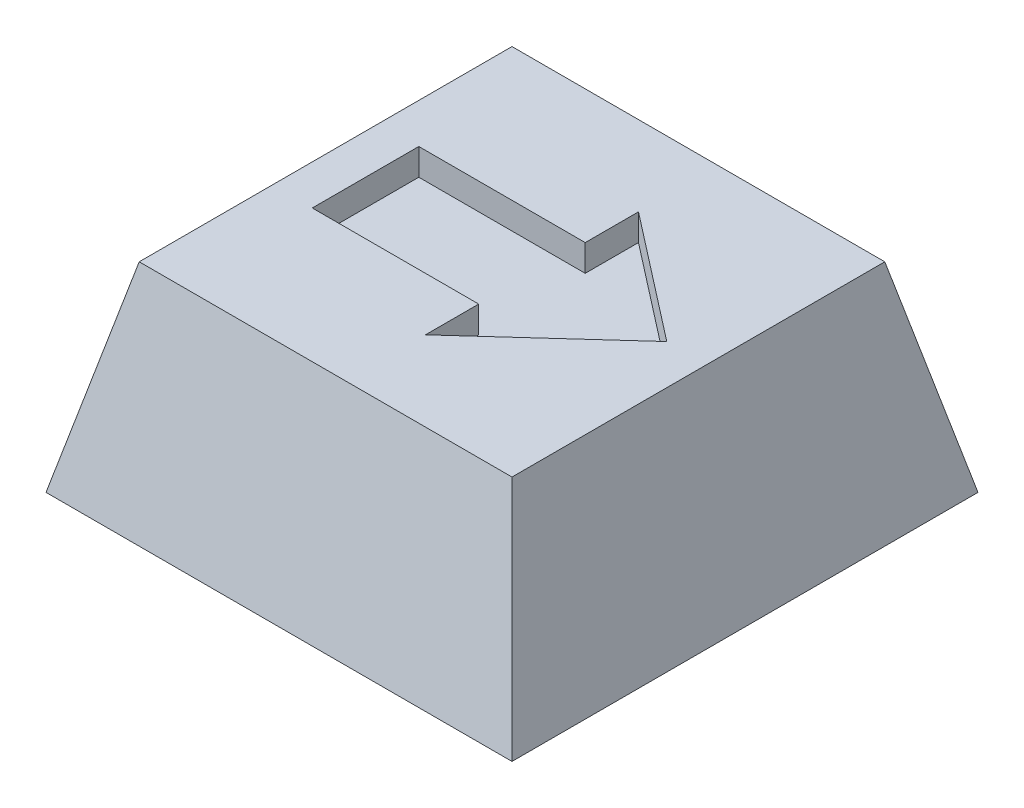
ISO-10303-21;
HEADER;
FILE_DESCRIPTION(('STEP AP214'),'2;1');
FILE_NAME('part.step','',(''),(''),'','','');
FILE_SCHEMA(('AUTOMOTIVE_DESIGN { 1 0 10303 214 1 1 1 1 }'));
ENDSEC;
DATA;
#1=APPLICATION_CONTEXT('core data for automotive mechanical design processes');
#2=APPLICATION_PROTOCOL_DEFINITION('international standard','automotive_design',2000,#1);
#3=PRODUCT_CONTEXT('',#1,'mechanical');
#4=PRODUCT('Part','Part','',(#3));
#5=PRODUCT_RELATED_PRODUCT_CATEGORY('part','',(#4));
#6=PRODUCT_DEFINITION_FORMATION('','',#4);
#7=PRODUCT_DEFINITION_CONTEXT('part definition',#1,'design');
#8=PRODUCT_DEFINITION('design','',#6,#7);
#9=PRODUCT_DEFINITION_SHAPE('','',#8);
#10=(LENGTH_UNIT() NAMED_UNIT(*) SI_UNIT(.MILLI.,.METRE.));
#11=(NAMED_UNIT(*) PLANE_ANGLE_UNIT() SI_UNIT($,.RADIAN.));
#12=(NAMED_UNIT(*) SI_UNIT($,.STERADIAN.) SOLID_ANGLE_UNIT());
#13=UNCERTAINTY_MEASURE_WITH_UNIT(LENGTH_MEASURE(1.E-05),#10,'distance_accuracy_value','');
#14=(GEOMETRIC_REPRESENTATION_CONTEXT(3) GLOBAL_UNCERTAINTY_ASSIGNED_CONTEXT((#13)) GLOBAL_UNIT_ASSIGNED_CONTEXT((#10,
#11,#12)) REPRESENTATION_CONTEXT('',''));
#15=CARTESIAN_POINT('',(0.,0.,0.));
#16=DIRECTION('',(0.,0.,1.));
#17=DIRECTION('',(1.,0.,0.));
#18=AXIS2_PLACEMENT_3D('',#15,#16,#17);
#19=CARTESIAN_POINT('',(0.,3.,0.));
#20=DIRECTION('',(0.,-1.,0.));
#21=DIRECTION('',(0.,0.,-1.));
#22=AXIS2_PLACEMENT_3D('',#19,#20,#21);
#23=PLANE('',#22);
#24=DIRECTION('',(0.,0.,-1.));
#25=VECTOR('',#24,1.);
#26=CARTESIAN_POINT('',(3.8,3.,0.));
#27=LINE('',#26,#25);
#28=CARTESIAN_POINT('',(3.8,3.,-1.9));
#29=VERTEX_POINT('',#28);
#30=CARTESIAN_POINT('',(3.8,3.,-2.7));
#31=VERTEX_POINT('',#30);
#32=EDGE_CURVE('E169',#29,#31,#27,.T.);
#33=ORIENTED_EDGE('',*,*,#32,.T.);
#34=DIRECTION('',(1.,0.,0.));
#35=VECTOR('',#34,1.);
#36=CARTESIAN_POINT('',(0.,3.,-2.7));
#37=LINE('',#36,#35);
#38=CARTESIAN_POINT('',(1.3,3.,-2.7));
#39=VERTEX_POINT('',#38);
#40=EDGE_CURVE('E58',#39,#31,#37,.T.);
#41=ORIENTED_EDGE('',*,*,#40,.F.);
#42=DIRECTION('',(0.,0.,1.));
#43=VECTOR('',#42,1.);
#44=CARTESIAN_POINT('',(1.3,3.,0.));
#45=LINE('',#44,#43);
#46=CARTESIAN_POINT('',(1.3,3.,-4.3));
#47=VERTEX_POINT('',#46);
#48=EDGE_CURVE('E150',#47,#39,#45,.T.);
#49=ORIENTED_EDGE('',*,*,#48,.F.);
#50=DIRECTION('',(1.,0.,0.));
#51=VECTOR('',#50,1.);
#52=CARTESIAN_POINT('',(0.,3.,-4.3));
#53=LINE('',#52,#51);
#54=CARTESIAN_POINT('',(3.8,3.,-4.3));
#55=VERTEX_POINT('',#54);
#56=EDGE_CURVE('E154',#47,#55,#53,.T.);
#57=ORIENTED_EDGE('',*,*,#56,.T.);
#58=CARTESIAN_POINT('',(3.8,3.,-5.1));
#59=VERTEX_POINT('',#58);
#60=EDGE_CURVE('E173',#55,#59,#27,.T.);
#61=ORIENTED_EDGE('',*,*,#60,.T.);
#62=DIRECTION('',(0.78987507361465,0.,0.61326777844776));
#63=VECTOR('',#62,1.);
#64=CARTESIAN_POINT('',(3.89963515011183,3.,-5.02264216303881));
#65=LINE('',#64,#63);
#66=CARTESIAN_POINT('',(5.7,3.,-3.6248189011479));
#67=VERTEX_POINT('',#66);
#68=EDGE_CURVE('E177',#59,#67,#65,.T.);
#69=ORIENTED_EDGE('',*,*,#68,.T.);
#70=DIRECTION('',(-0.740415843619596,0.,0.672149074623391));
#71=VECTOR('',#70,1.);
#72=CARTESIAN_POINT('',(0.77120797252663,3.,0.849535650859009));
#73=LINE('',#72,#71);
#74=EDGE_CURVE('E172',#67,#29,#73,.T.);
#75=ORIENTED_EDGE('',*,*,#74,.T.);
#76=EDGE_LOOP('',(#33,#41,#49,#57,#61,#69,#75));
#77=FACE_BOUND('',#76,.T.);
#78=DIRECTION('',(-1.,0.,0.));
#79=VECTOR('',#78,1.);
#80=CARTESIAN_POINT('',(11.,3.,-0.7));
#81=LINE('',#80,#79);
#82=CARTESIAN_POINT('',(6.3,3.,-0.7));
#83=VERTEX_POINT('',#82);
#84=CARTESIAN_POINT('',(0.7,3.,-0.7));
#85=VERTEX_POINT('',#84);
#86=EDGE_CURVE('E65',#83,#85,#81,.T.);
#87=ORIENTED_EDGE('',*,*,#86,.F.);
#88=DIRECTION('',(0.,0.,1.));
#89=VECTOR('',#88,1.);
#90=CARTESIAN_POINT('',(6.3,3.,-7.));
#91=LINE('',#90,#89);
#92=CARTESIAN_POINT('',(6.3,3.,-6.3));
#93=VERTEX_POINT('',#92);
#94=EDGE_CURVE('E221',#93,#83,#91,.T.);
#95=ORIENTED_EDGE('',*,*,#94,.F.);
#96=DIRECTION('',(-1.,0.,0.));
#97=VECTOR('',#96,1.);
#98=CARTESIAN_POINT('',(11.,3.,-6.3));
#99=LINE('',#98,#97);
#100=CARTESIAN_POINT('',(0.699999999999998,3.,-6.3));
#101=VERTEX_POINT('',#100);
#102=EDGE_CURVE('E206',#93,#101,#99,.T.);
#103=ORIENTED_EDGE('',*,*,#102,.T.);
#104=DIRECTION('',(0.,0.,1.));
#105=VECTOR('',#104,1.);
#106=CARTESIAN_POINT('',(0.7,3.,-7.));
#107=LINE('',#106,#105);
#108=EDGE_CURVE('E222',#101,#85,#107,.T.);
#109=ORIENTED_EDGE('',*,*,#108,.T.);
#110=EDGE_LOOP('',(#87,#95,#103,#109));
#111=FACE_BOUND('',#110,.T.);
#112=ADVANCED_FACE('F42',(#77,#111),#23,.F.);
#113=CARTESIAN_POINT('',(7.,0.,-7.));
#114=DIRECTION('',(-0.973841209741793,-0.227229615606418,0.));
#115=DIRECTION('',(0.227229615606418,-0.973841209741793,0.));
#116=AXIS2_PLACEMENT_3D('',#113,#114,#115);
#117=PLANE('',#116);
#118=DIRECTION('',(-0.221581128241521,0.949633406749377,-0.221581128241521));
#119=VECTOR('',#118,1.);
#120=CARTESIAN_POINT('',(6.6563126252505,1.47294589178357,-0.343687374749499));
#121=LINE('',#120,#119);
#122=CARTESIAN_POINT('',(7.,0.,0.));
#123=VERTEX_POINT('',#122);
#124=EDGE_CURVE('E218',#123,#83,#121,.T.);
#125=ORIENTED_EDGE('',*,*,#124,.F.);
#126=DIRECTION('',(0.,0.,-1.));
#127=VECTOR('',#126,1.);
#128=CARTESIAN_POINT('',(7.,0.,0.));
#129=LINE('',#128,#127);
#130=CARTESIAN_POINT('',(7.,0.,-7.));
#131=VERTEX_POINT('',#130);
#132=EDGE_CURVE('E236',#123,#131,#129,.T.);
#133=ORIENTED_EDGE('',*,*,#132,.T.);
#134=DIRECTION('',(0.221581128241521,-0.949633406749377,-0.221581128241521));
#135=VECTOR('',#134,1.);
#136=CARTESIAN_POINT('',(7.,0.,-7.));
#137=LINE('',#136,#135);
#138=EDGE_CURVE('E212',#93,#131,#137,.T.);
#139=ORIENTED_EDGE('',*,*,#138,.F.);
#140=ORIENTED_EDGE('',*,*,#94,.T.);
#141=EDGE_LOOP('',(#125,#133,#139,#140));
#142=FACE_BOUND('',#141,.T.);
#143=ADVANCED_FACE('F260',(#142),#117,.F.);
#144=CARTESIAN_POINT('',(0.,0.,-7.));
#145=DIRECTION('',(0.973841209741793,-0.227229615606418,0.));
#146=DIRECTION('',(0.227229615606418,0.973841209741793,0.));
#147=AXIS2_PLACEMENT_3D('',#144,#145,#146);
#148=PLANE('',#147);
#149=DIRECTION('',(-0.221581128241521,-0.949633406749378,0.221581128241521));
#150=VECTOR('',#149,1.);
#151=CARTESIAN_POINT('',(0.343687374749499,1.47294589178357,-0.3436873747495));
#152=LINE('',#151,#150);
#153=CARTESIAN_POINT('',(0.,0.,0.));
#154=VERTEX_POINT('',#153);
#155=EDGE_CURVE('E11',#85,#154,#152,.T.);
#156=ORIENTED_EDGE('',*,*,#155,.F.);
#157=ORIENTED_EDGE('',*,*,#108,.F.);
#158=DIRECTION('',(0.221581128241521,0.949633406749377,0.221581128241521));
#159=VECTOR('',#158,1.);
#160=CARTESIAN_POINT('',(0.,0.,-7.));
#161=LINE('',#160,#159);
#162=CARTESIAN_POINT('',(0.,0.,-7.));
#163=VERTEX_POINT('',#162);
#164=EDGE_CURVE('E51',#163,#101,#161,.T.);
#165=ORIENTED_EDGE('',*,*,#164,.F.);
#166=DIRECTION('',(0.,0.,1.));
#167=VECTOR('',#166,1.);
#168=CARTESIAN_POINT('',(0.,0.,0.));
#169=LINE('',#168,#167);
#170=EDGE_CURVE('E226',#163,#154,#169,.T.);
#171=ORIENTED_EDGE('',*,*,#170,.T.);
#172=EDGE_LOOP('',(#156,#157,#165,#171));
#173=FACE_BOUND('',#172,.T.);
#174=ADVANCED_FACE('F253',(#173),#148,.F.);
#175=CARTESIAN_POINT('',(0.,0.,0.));
#176=DIRECTION('',(0.,-1.,0.));
#177=DIRECTION('',(0.,0.,-1.));
#178=AXIS2_PLACEMENT_3D('',#175,#176,#177);
#179=PLANE('',#178);
#180=CARTESIAN_POINT('',(3.5,0.,-3.5));
#181=DIRECTION('',(0.,-1.,0.));
#182=DIRECTION('',(0.,0.,-1.));
#183=AXIS2_PLACEMENT_3D('',#180,#181,#182);
#184=CIRCLE('',#183,1.8);
#185=CARTESIAN_POINT('',(3.5,0.,-5.3));
#186=VERTEX_POINT('',#185);
#187=EDGE_CURVE('E187',#186,#186,#184,.T.);
#188=ORIENTED_EDGE('',*,*,#187,.F.);
#189=EDGE_LOOP('',(#188));
#190=FACE_BOUND('',#189,.T.);
#191=ORIENTED_EDGE('',*,*,#170,.F.);
#192=DIRECTION('',(-1.,0.,0.));
#193=VECTOR('',#192,1.);
#194=CARTESIAN_POINT('',(0.,0.,-7.));
#195=LINE('',#194,#193);
#196=EDGE_CURVE('E240',#131,#163,#195,.T.);
#197=ORIENTED_EDGE('',*,*,#196,.F.);
#198=ORIENTED_EDGE('',*,*,#132,.F.);
#199=DIRECTION('',(1.,0.,0.));
#200=VECTOR('',#199,1.);
#201=CARTESIAN_POINT('',(0.,0.,0.));
#202=LINE('',#201,#200);
#203=EDGE_CURVE('E233',#154,#123,#202,.T.);
#204=ORIENTED_EDGE('',*,*,#203,.F.);
#205=EDGE_LOOP('',(#191,#197,#198,#204));
#206=FACE_BOUND('',#205,.T.);
#207=ADVANCED_FACE('F44',(#190,#206),#179,.T.);
#208=CARTESIAN_POINT('',(11.,3.,-6.3));
#209=DIRECTION('',(0.,0.227229615606418,-0.973841209741793));
#210=DIRECTION('',(0.,0.973841209741793,0.227229615606418));
#211=AXIS2_PLACEMENT_3D('',#208,#209,#210);
#212=PLANE('',#211);
#213=ORIENTED_EDGE('',*,*,#138,.T.);
#214=ORIENTED_EDGE('',*,*,#196,.T.);
#215=ORIENTED_EDGE('',*,*,#164,.T.);
#216=ORIENTED_EDGE('',*,*,#102,.F.);
#217=EDGE_LOOP('',(#213,#214,#215,#216));
#218=FACE_BOUND('',#217,.T.);
#219=ADVANCED_FACE('F245',(#218),#212,.T.);
#220=CARTESIAN_POINT('',(11.,0.,0.));
#221=DIRECTION('',(0.,0.227229615606418,0.973841209741793));
#222=DIRECTION('',(0.,-0.973841209741793,0.227229615606418));
#223=AXIS2_PLACEMENT_3D('',#220,#221,#222);
#224=PLANE('',#223);
#225=ORIENTED_EDGE('',*,*,#124,.T.);
#226=ORIENTED_EDGE('',*,*,#86,.T.);
#227=ORIENTED_EDGE('',*,*,#155,.T.);
#228=ORIENTED_EDGE('',*,*,#203,.T.);
#229=EDGE_LOOP('',(#225,#226,#227,#228));
#230=FACE_BOUND('',#229,.T.);
#231=ADVANCED_FACE('F255',(#230),#224,.T.);
#232=CARTESIAN_POINT('',(3.5,0.8,-3.5));
#233=DIRECTION('',(0.,-1.,0.));
#234=DIRECTION('',(0.,0.,-1.));
#235=AXIS2_PLACEMENT_3D('',#232,#233,#234);
#236=CYLINDRICAL_SURFACE('',#235,1.8);
#237=CARTESIAN_POINT('',(3.5,0.8,-3.5));
#238=DIRECTION('',(0.,-1.,0.));
#239=DIRECTION('',(0.,0.,-1.));
#240=AXIS2_PLACEMENT_3D('',#237,#238,#239);
#241=CIRCLE('',#240,1.8);
#242=CARTESIAN_POINT('',(3.5,0.8,-5.3));
#243=VERTEX_POINT('',#242);
#244=EDGE_CURVE('E202',#243,#243,#241,.T.);
#245=ORIENTED_EDGE('',*,*,#244,.F.);
#246=EDGE_LOOP('',(#245));
#247=FACE_BOUND('',#246,.T.);
#248=ORIENTED_EDGE('',*,*,#187,.T.);
#249=EDGE_LOOP('',(#248));
#250=FACE_BOUND('',#249,.T.);
#251=ADVANCED_FACE('F281',(#247,#250),#236,.F.);
#252=CARTESIAN_POINT('',(3.5,0.8,-3.5));
#253=DIRECTION('',(0.,-1.,0.));
#254=DIRECTION('',(0.,0.,-1.));
#255=AXIS2_PLACEMENT_3D('',#252,#253,#254);
#256=PLANE('',#255);
#257=ORIENTED_EDGE('',*,*,#244,.T.);
#258=EDGE_LOOP('',(#257));
#259=FACE_BOUND('',#258,.T.);
#260=ADVANCED_FACE('F284',(#259),#256,.T.);
#261=CARTESIAN_POINT('',(0.,2.6,-2.7));
#262=DIRECTION('',(0.,0.,1.));
#263=DIRECTION('',(1.,0.,0.));
#264=AXIS2_PLACEMENT_3D('',#261,#262,#263);
#265=PLANE('',#264);
#266=ORIENTED_EDGE('',*,*,#40,.T.);
#267=DIRECTION('',(0.,1.,0.));
#268=VECTOR('',#267,1.);
#269=CARTESIAN_POINT('',(3.8,2.6,-2.7));
#270=LINE('',#269,#268);
#271=CARTESIAN_POINT('',(3.8,2.6,-2.7));
#272=VERTEX_POINT('',#271);
#273=EDGE_CURVE('E129',#272,#31,#270,.T.);
#274=ORIENTED_EDGE('',*,*,#273,.F.);
#275=DIRECTION('',(1.,0.,0.));
#276=VECTOR('',#275,1.);
#277=CARTESIAN_POINT('',(0.,2.6,-2.7));
#278=LINE('',#277,#276);
#279=CARTESIAN_POINT('',(1.3,2.6,-2.7));
#280=VERTEX_POINT('',#279);
#281=EDGE_CURVE('E137',#280,#272,#278,.T.);
#282=ORIENTED_EDGE('',*,*,#281,.F.);
#283=DIRECTION('',(0.,1.,0.));
#284=VECTOR('',#283,1.);
#285=CARTESIAN_POINT('',(1.3,2.6,-2.7));
#286=LINE('',#285,#284);
#287=EDGE_CURVE('E184',#280,#39,#286,.T.);
#288=ORIENTED_EDGE('',*,*,#287,.T.);
#289=EDGE_LOOP('',(#266,#274,#282,#288));
#290=FACE_BOUND('',#289,.T.);
#291=ADVANCED_FACE('F141',(#290),#265,.F.);
#292=CARTESIAN_POINT('',(1.3,2.6,0.));
#293=DIRECTION('',(-1.,0.,0.));
#294=DIRECTION('',(0.,0.,1.));
#295=AXIS2_PLACEMENT_3D('',#292,#293,#294);
#296=PLANE('',#295);
#297=ORIENTED_EDGE('',*,*,#48,.T.);
#298=ORIENTED_EDGE('',*,*,#287,.F.);
#299=DIRECTION('',(0.,0.,1.));
#300=VECTOR('',#299,1.);
#301=CARTESIAN_POINT('',(1.3,2.6,0.));
#302=LINE('',#301,#300);
#303=CARTESIAN_POINT('',(1.3,2.6,-4.3));
#304=VERTEX_POINT('',#303);
#305=EDGE_CURVE('E144',#304,#280,#302,.T.);
#306=ORIENTED_EDGE('',*,*,#305,.F.);
#307=DIRECTION('',(0.,1.,0.));
#308=VECTOR('',#307,1.);
#309=CARTESIAN_POINT('',(1.3,2.6,-4.3));
#310=LINE('',#309,#308);
#311=EDGE_CURVE('E188',#304,#47,#310,.T.);
#312=ORIENTED_EDGE('',*,*,#311,.T.);
#313=EDGE_LOOP('',(#297,#298,#306,#312));
#314=FACE_BOUND('',#313,.T.);
#315=ADVANCED_FACE('F291',(#314),#296,.F.);
#316=CARTESIAN_POINT('',(0.,2.6,-4.3));
#317=DIRECTION('',(0.,0.,1.));
#318=DIRECTION('',(1.,0.,0.));
#319=AXIS2_PLACEMENT_3D('',#316,#317,#318);
#320=PLANE('',#319);
#321=ORIENTED_EDGE('',*,*,#56,.F.);
#322=ORIENTED_EDGE('',*,*,#311,.F.);
#323=DIRECTION('',(1.,0.,0.));
#324=VECTOR('',#323,1.);
#325=CARTESIAN_POINT('',(0.,2.6,-4.3));
#326=LINE('',#325,#324);
#327=CARTESIAN_POINT('',(3.8,2.6,-4.3));
#328=VERTEX_POINT('',#327);
#329=EDGE_CURVE('E162',#304,#328,#326,.T.);
#330=ORIENTED_EDGE('',*,*,#329,.T.);
#331=DIRECTION('',(0.,1.,0.));
#332=VECTOR('',#331,1.);
#333=CARTESIAN_POINT('',(3.8,2.6,-4.3));
#334=LINE('',#333,#332);
#335=EDGE_CURVE('E191',#328,#55,#334,.T.);
#336=ORIENTED_EDGE('',*,*,#335,.T.);
#337=EDGE_LOOP('',(#321,#322,#330,#336));
#338=FACE_BOUND('',#337,.T.);
#339=ADVANCED_FACE('F303',(#338),#320,.T.);
#340=CARTESIAN_POINT('',(3.8,2.6,0.));
#341=DIRECTION('',(1.,0.,0.));
#342=DIRECTION('',(0.,0.,-1.));
#343=AXIS2_PLACEMENT_3D('',#340,#341,#342);
#344=PLANE('',#343);
#345=ORIENTED_EDGE('',*,*,#60,.F.);
#346=ORIENTED_EDGE('',*,*,#335,.F.);
#347=DIRECTION('',(0.,0.,-1.));
#348=VECTOR('',#347,1.);
#349=CARTESIAN_POINT('',(3.8,2.6,0.));
#350=LINE('',#349,#348);
#351=CARTESIAN_POINT('',(3.8,2.6,-5.1));
#352=VERTEX_POINT('',#351);
#353=EDGE_CURVE('E139',#328,#352,#350,.T.);
#354=ORIENTED_EDGE('',*,*,#353,.T.);
#355=DIRECTION('',(0.,1.,0.));
#356=VECTOR('',#355,1.);
#357=CARTESIAN_POINT('',(3.8,2.6,-5.1));
#358=LINE('',#357,#356);
#359=EDGE_CURVE('E194',#352,#59,#358,.T.);
#360=ORIENTED_EDGE('',*,*,#359,.T.);
#361=EDGE_LOOP('',(#345,#346,#354,#360));
#362=FACE_BOUND('',#361,.T.);
#363=ADVANCED_FACE('F299',(#362),#344,.T.);
#364=CARTESIAN_POINT('',(3.89963515011183,2.6,-5.02264216303881));
#365=DIRECTION('',(-0.61326777844776,0.,0.78987507361465));
#366=DIRECTION('',(0.78987507361465,0.,0.61326777844776));
#367=AXIS2_PLACEMENT_3D('',#364,#365,#366);
#368=PLANE('',#367);
#369=ORIENTED_EDGE('',*,*,#68,.F.);
#370=ORIENTED_EDGE('',*,*,#359,.F.);
#371=DIRECTION('',(0.78987507361465,0.,0.61326777844776));
#372=VECTOR('',#371,1.);
#373=CARTESIAN_POINT('',(3.89963515011183,2.6,-5.02264216303881));
#374=LINE('',#373,#372);
#375=CARTESIAN_POINT('',(5.7,2.6,-3.6248189011479));
#376=VERTEX_POINT('',#375);
#377=EDGE_CURVE('E159',#352,#376,#374,.T.);
#378=ORIENTED_EDGE('',*,*,#377,.T.);
#379=DIRECTION('',(0.,1.,0.));
#380=VECTOR('',#379,1.);
#381=CARTESIAN_POINT('',(5.7,2.6,-3.6248189011479));
#382=LINE('',#381,#380);
#383=EDGE_CURVE('E197',#376,#67,#382,.T.);
#384=ORIENTED_EDGE('',*,*,#383,.T.);
#385=EDGE_LOOP('',(#369,#370,#378,#384));
#386=FACE_BOUND('',#385,.T.);
#387=ADVANCED_FACE('F295',(#386),#368,.T.);
#388=CARTESIAN_POINT('',(0.77120797252663,2.6,0.849535650859009));
#389=DIRECTION('',(-0.672149074623391,0.,-0.740415843619596));
#390=DIRECTION('',(-0.740415843619596,0.,0.672149074623391));
#391=AXIS2_PLACEMENT_3D('',#388,#389,#390);
#392=PLANE('',#391);
#393=ORIENTED_EDGE('',*,*,#74,.F.);
#394=ORIENTED_EDGE('',*,*,#383,.F.);
#395=DIRECTION('',(-0.740415843619596,0.,0.672149074623391));
#396=VECTOR('',#395,1.);
#397=CARTESIAN_POINT('',(0.77120797252663,2.6,0.849535650859009));
#398=LINE('',#397,#396);
#399=CARTESIAN_POINT('',(3.8,2.6,-1.9));
#400=VERTEX_POINT('',#399);
#401=EDGE_CURVE('E136',#376,#400,#398,.T.);
#402=ORIENTED_EDGE('',*,*,#401,.T.);
#403=DIRECTION('',(0.,1.,0.));
#404=VECTOR('',#403,1.);
#405=CARTESIAN_POINT('',(3.8,2.6,-1.9));
#406=LINE('',#405,#404);
#407=EDGE_CURVE('E131',#400,#29,#406,.T.);
#408=ORIENTED_EDGE('',*,*,#407,.T.);
#409=EDGE_LOOP('',(#393,#394,#402,#408));
#410=FACE_BOUND('',#409,.T.);
#411=ADVANCED_FACE('F292',(#410),#392,.T.);
#412=ORIENTED_EDGE('',*,*,#32,.F.);
#413=ORIENTED_EDGE('',*,*,#407,.F.);
#414=EDGE_CURVE('E126',#400,#272,#350,.T.);
#415=ORIENTED_EDGE('',*,*,#414,.T.);
#416=ORIENTED_EDGE('',*,*,#273,.T.);
#417=EDGE_LOOP('',(#412,#413,#415,#416));
#418=FACE_BOUND('',#417,.T.);
#419=ADVANCED_FACE('F128',(#418),#344,.T.);
#420=CARTESIAN_POINT('',(0.,2.6,0.));
#421=DIRECTION('',(0.,1.,0.));
#422=DIRECTION('',(0.,0.,1.));
#423=AXIS2_PLACEMENT_3D('',#420,#421,#422);
#424=PLANE('',#423);
#425=ORIENTED_EDGE('',*,*,#281,.T.);
#426=ORIENTED_EDGE('',*,*,#414,.F.);
#427=ORIENTED_EDGE('',*,*,#401,.F.);
#428=ORIENTED_EDGE('',*,*,#377,.F.);
#429=ORIENTED_EDGE('',*,*,#353,.F.);
#430=ORIENTED_EDGE('',*,*,#329,.F.);
#431=ORIENTED_EDGE('',*,*,#305,.T.);
#432=EDGE_LOOP('',(#425,#426,#427,#428,#429,#430,#431));
#433=FACE_BOUND('',#432,.T.);
#434=ADVANCED_FACE('F146',(#433),#424,.T.);
#435=CLOSED_SHELL('',(#112,#143,#174,#207,#219,#231,#251,#260,#291,#315,#339,#363,#387,#411,
#419,#434));
#436=MANIFOLD_SOLID_BREP('B2',#435);
#437=ADVANCED_BREP_SHAPE_REPRESENTATION('',(#18,#436),#14);
#438=SHAPE_DEFINITION_REPRESENTATION(#9,#437);
ENDSEC;
END-ISO-10303-21;
